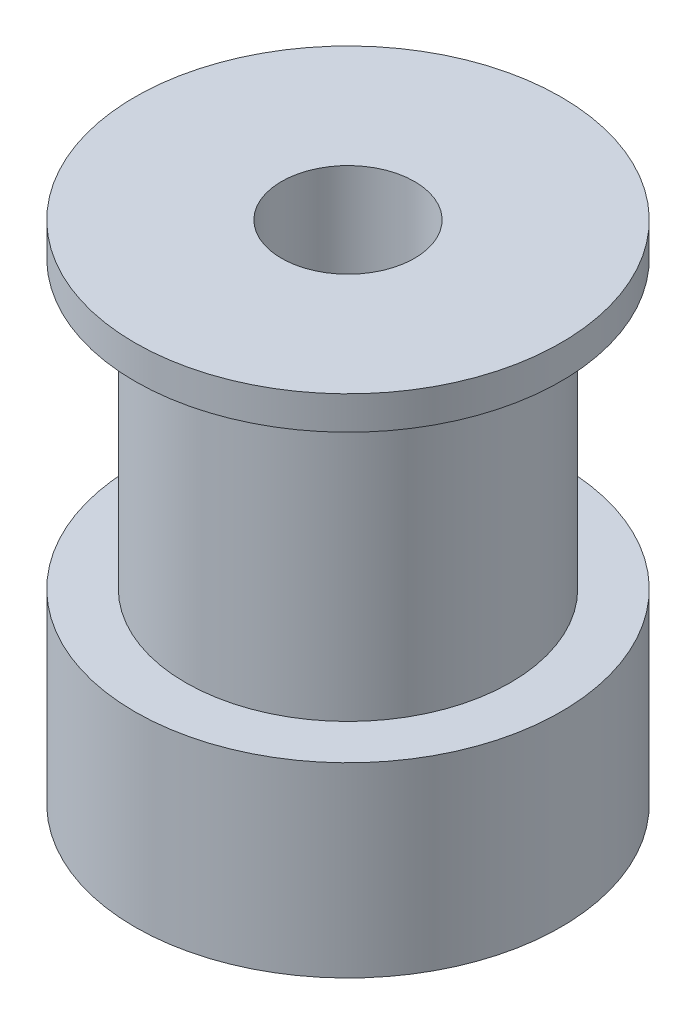
ISO-10303-21;
HEADER;
FILE_DESCRIPTION(('STEP AP214'),'2;1');
FILE_NAME('part.step','',(''),(''),'','','');
FILE_SCHEMA(('AUTOMOTIVE_DESIGN { 1 0 10303 214 1 1 1 1 }'));
ENDSEC;
DATA;
#1=APPLICATION_CONTEXT('core data for automotive mechanical design processes');
#2=APPLICATION_PROTOCOL_DEFINITION('international standard','automotive_design',2000,#1);
#3=PRODUCT_CONTEXT('',#1,'mechanical');
#4=PRODUCT('Part','Part','',(#3));
#5=PRODUCT_RELATED_PRODUCT_CATEGORY('part','',(#4));
#6=PRODUCT_DEFINITION_FORMATION('','',#4);
#7=PRODUCT_DEFINITION_CONTEXT('part definition',#1,'design');
#8=PRODUCT_DEFINITION('design','',#6,#7);
#9=PRODUCT_DEFINITION_SHAPE('','',#8);
#10=(LENGTH_UNIT() NAMED_UNIT(*) SI_UNIT(.MILLI.,.METRE.));
#11=(NAMED_UNIT(*) PLANE_ANGLE_UNIT() SI_UNIT($,.RADIAN.));
#12=(NAMED_UNIT(*) SI_UNIT($,.STERADIAN.) SOLID_ANGLE_UNIT());
#13=UNCERTAINTY_MEASURE_WITH_UNIT(LENGTH_MEASURE(1.E-05),#10,'distance_accuracy_value','');
#14=(GEOMETRIC_REPRESENTATION_CONTEXT(3) GLOBAL_UNCERTAINTY_ASSIGNED_CONTEXT((#13)) GLOBAL_UNIT_ASSIGNED_CONTEXT((#10,
#11,#12)) REPRESENTATION_CONTEXT('',''));
#15=CARTESIAN_POINT('',(0.,0.,0.));
#16=DIRECTION('',(0.,0.,1.));
#17=DIRECTION('',(1.,0.,0.));
#18=AXIS2_PLACEMENT_3D('',#15,#16,#17);
#19=CARTESIAN_POINT('',(8.,0.,0.));
#20=DIRECTION('',(0.,-1.,0.));
#21=DIRECTION('',(0.,0.,-1.));
#22=AXIS2_PLACEMENT_3D('',#19,#20,#21);
#23=PLANE('',#22);
#24=CARTESIAN_POINT('',(0.,0.,0.));
#25=DIRECTION('',(0.,-1.,0.));
#26=DIRECTION('',(0.,0.,-1.));
#27=AXIS2_PLACEMENT_3D('',#24,#25,#26);
#28=CIRCLE('',#27,8.);
#29=CARTESIAN_POINT('',(0.,0.,-8.));
#30=VERTEX_POINT('',#29);
#31=EDGE_CURVE('E62',#30,#30,#28,.T.);
#32=ORIENTED_EDGE('',*,*,#31,.T.);
#33=EDGE_LOOP('',(#32));
#34=FACE_BOUND('',#33,.T.);
#35=CARTESIAN_POINT('',(0.,0.,0.));
#36=DIRECTION('',(0.,-1.,0.));
#37=DIRECTION('',(0.,0.,-1.));
#38=AXIS2_PLACEMENT_3D('',#35,#36,#37);
#39=CIRCLE('',#38,2.5);
#40=CARTESIAN_POINT('',(0.,0.,-2.5));
#41=VERTEX_POINT('',#40);
#42=EDGE_CURVE('E10',#41,#41,#39,.T.);
#43=ORIENTED_EDGE('',*,*,#42,.F.);
#44=EDGE_LOOP('',(#43));
#45=FACE_BOUND('',#44,.T.);
#46=ADVANCED_FACE('F34',(#34,#45),#23,.T.);
#47=CARTESIAN_POINT('',(0.,0.,0.));
#48=DIRECTION('',(0.,-1.,0.));
#49=DIRECTION('',(0.,0.,-1.));
#50=AXIS2_PLACEMENT_3D('',#47,#48,#49);
#51=CYLINDRICAL_SURFACE('',#50,2.5);
#52=ORIENTED_EDGE('',*,*,#42,.T.);
#53=EDGE_LOOP('',(#52));
#54=FACE_BOUND('',#53,.T.);
#55=CARTESIAN_POINT('',(0.,19.,0.));
#56=DIRECTION('',(0.,-1.,0.));
#57=DIRECTION('',(0.,0.,-1.));
#58=AXIS2_PLACEMENT_3D('',#55,#56,#57);
#59=CIRCLE('',#58,2.5);
#60=CARTESIAN_POINT('',(0.,19.,-2.5));
#61=VERTEX_POINT('',#60);
#62=EDGE_CURVE('E40',#61,#61,#59,.T.);
#63=ORIENTED_EDGE('',*,*,#62,.F.);
#64=EDGE_LOOP('',(#63));
#65=FACE_BOUND('',#64,.T.);
#66=ADVANCED_FACE('F80',(#54,#65),#51,.F.);
#67=CARTESIAN_POINT('',(2.5,19.,0.));
#68=DIRECTION('',(0.,1.,0.));
#69=DIRECTION('',(0.,0.,1.));
#70=AXIS2_PLACEMENT_3D('',#67,#68,#69);
#71=PLANE('',#70);
#72=ORIENTED_EDGE('',*,*,#62,.T.);
#73=EDGE_LOOP('',(#72));
#74=FACE_BOUND('',#73,.T.);
#75=CARTESIAN_POINT('',(0.,19.,0.));
#76=DIRECTION('',(0.,-1.,0.));
#77=DIRECTION('',(0.,0.,-1.));
#78=AXIS2_PLACEMENT_3D('',#75,#76,#77);
#79=CIRCLE('',#78,7.99999999999999);
#80=CARTESIAN_POINT('',(0.,19.,-7.99999999999999));
#81=VERTEX_POINT('',#80);
#82=EDGE_CURVE('E44',#81,#81,#79,.T.);
#83=ORIENTED_EDGE('',*,*,#82,.F.);
#84=EDGE_LOOP('',(#83));
#85=FACE_BOUND('',#84,.T.);
#86=ADVANCED_FACE('F84',(#74,#85),#71,.T.);
#87=CARTESIAN_POINT('',(0.,0.,0.));
#88=DIRECTION('',(0.,-1.,0.));
#89=DIRECTION('',(0.,0.,-1.));
#90=AXIS2_PLACEMENT_3D('',#87,#88,#89);
#91=CYLINDRICAL_SURFACE('',#90,8.);
#92=ORIENTED_EDGE('',*,*,#82,.T.);
#93=EDGE_LOOP('',(#92));
#94=FACE_BOUND('',#93,.T.);
#95=CARTESIAN_POINT('',(0.,17.75,0.));
#96=DIRECTION('',(0.,-1.,0.));
#97=DIRECTION('',(0.,0.,-1.));
#98=AXIS2_PLACEMENT_3D('',#95,#96,#97);
#99=CIRCLE('',#98,8.);
#100=CARTESIAN_POINT('',(0.,17.75,-8.));
#101=VERTEX_POINT('',#100);
#102=EDGE_CURVE('E48',#101,#101,#99,.T.);
#103=ORIENTED_EDGE('',*,*,#102,.F.);
#104=EDGE_LOOP('',(#103));
#105=FACE_BOUND('',#104,.T.);
#106=ADVANCED_FACE('F88',(#94,#105),#91,.T.);
#107=CARTESIAN_POINT('',(8.,17.75,0.));
#108=DIRECTION('',(0.,-1.,0.));
#109=DIRECTION('',(0.,0.,-1.));
#110=AXIS2_PLACEMENT_3D('',#107,#108,#109);
#111=PLANE('',#110);
#112=ORIENTED_EDGE('',*,*,#102,.T.);
#113=EDGE_LOOP('',(#112));
#114=FACE_BOUND('',#113,.T.);
#115=CARTESIAN_POINT('',(0.,17.75,0.));
#116=DIRECTION('',(0.,-1.,0.));
#117=DIRECTION('',(0.,0.,-1.));
#118=AXIS2_PLACEMENT_3D('',#115,#116,#117);
#119=CIRCLE('',#118,6.1);
#120=CARTESIAN_POINT('',(0.,17.75,-6.1));
#121=VERTEX_POINT('',#120);
#122=EDGE_CURVE('E53',#121,#121,#119,.T.);
#123=ORIENTED_EDGE('',*,*,#122,.F.);
#124=EDGE_LOOP('',(#123));
#125=FACE_BOUND('',#124,.T.);
#126=ADVANCED_FACE('F94',(#114,#125),#111,.T.);
#127=CARTESIAN_POINT('',(0.,0.,0.));
#128=DIRECTION('',(0.,-1.,0.));
#129=DIRECTION('',(0.,0.,-1.));
#130=AXIS2_PLACEMENT_3D('',#127,#128,#129);
#131=CYLINDRICAL_SURFACE('',#130,6.1);
#132=ORIENTED_EDGE('',*,*,#122,.T.);
#133=EDGE_LOOP('',(#132));
#134=FACE_BOUND('',#133,.T.);
#135=CARTESIAN_POINT('',(0.,7.,0.));
#136=DIRECTION('',(0.,-1.,0.));
#137=DIRECTION('',(0.,0.,-1.));
#138=AXIS2_PLACEMENT_3D('',#135,#136,#137);
#139=CIRCLE('',#138,6.1);
#140=CARTESIAN_POINT('',(0.,7.,-6.1));
#141=VERTEX_POINT('',#140);
#142=EDGE_CURVE('E56',#141,#141,#139,.T.);
#143=ORIENTED_EDGE('',*,*,#142,.F.);
#144=EDGE_LOOP('',(#143));
#145=FACE_BOUND('',#144,.T.);
#146=ADVANCED_FACE('F76',(#134,#145),#131,.T.);
#147=CARTESIAN_POINT('',(6.1,7.,0.));
#148=DIRECTION('',(0.,1.,0.));
#149=DIRECTION('',(0.,0.,1.));
#150=AXIS2_PLACEMENT_3D('',#147,#148,#149);
#151=PLANE('',#150);
#152=ORIENTED_EDGE('',*,*,#142,.T.);
#153=EDGE_LOOP('',(#152));
#154=FACE_BOUND('',#153,.T.);
#155=CARTESIAN_POINT('',(0.,7.,0.));
#156=DIRECTION('',(0.,-1.,0.));
#157=DIRECTION('',(0.,0.,-1.));
#158=AXIS2_PLACEMENT_3D('',#155,#156,#157);
#159=CIRCLE('',#158,8.);
#160=CARTESIAN_POINT('',(0.,7.,-8.));
#161=VERTEX_POINT('',#160);
#162=EDGE_CURVE('E59',#161,#161,#159,.T.);
#163=ORIENTED_EDGE('',*,*,#162,.F.);
#164=EDGE_LOOP('',(#163));
#165=FACE_BOUND('',#164,.T.);
#166=ADVANCED_FACE('F70',(#154,#165),#151,.T.);
#167=CARTESIAN_POINT('',(0.,0.,0.));
#168=DIRECTION('',(0.,-1.,0.));
#169=DIRECTION('',(0.,0.,-1.));
#170=AXIS2_PLACEMENT_3D('',#167,#168,#169);
#171=CYLINDRICAL_SURFACE('',#170,8.);
#172=ORIENTED_EDGE('',*,*,#162,.T.);
#173=EDGE_LOOP('',(#172));
#174=FACE_BOUND('',#173,.T.);
#175=ORIENTED_EDGE('',*,*,#31,.F.);
#176=EDGE_LOOP('',(#175));
#177=FACE_BOUND('',#176,.T.);
#178=ADVANCED_FACE('F68',(#174,#177),#171,.T.);
#179=CLOSED_SHELL('',(#46,#66,#86,#106,#126,#146,#166,#178));
#180=MANIFOLD_SOLID_BREP('B2',#179);
#181=ADVANCED_BREP_SHAPE_REPRESENTATION('',(#18,#180),#14);
#182=SHAPE_DEFINITION_REPRESENTATION(#9,#181);
ENDSEC;
END-ISO-10303-21;
